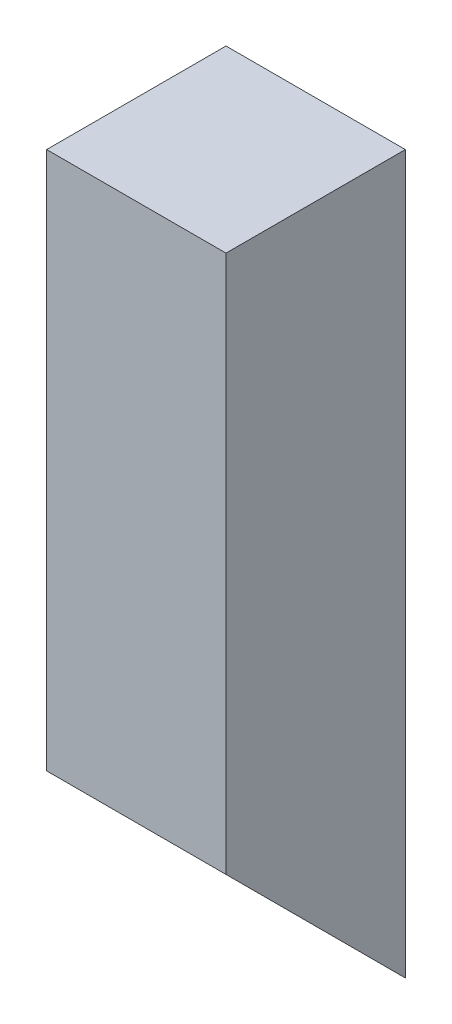
ISO-10303-21;
HEADER;
FILE_DESCRIPTION(('STEP AP214'),'2;1');
FILE_NAME('part.step','',(''),(''),'','','');
FILE_SCHEMA(('AUTOMOTIVE_DESIGN { 1 0 10303 214 1 1 1 1 }'));
ENDSEC;
DATA;
#1=APPLICATION_CONTEXT('core data for automotive mechanical design processes');
#2=APPLICATION_PROTOCOL_DEFINITION('international standard','automotive_design',2000,#1);
#3=PRODUCT_CONTEXT('',#1,'mechanical');
#4=PRODUCT('Part','Part','',(#3));
#5=PRODUCT_RELATED_PRODUCT_CATEGORY('part','',(#4));
#6=PRODUCT_DEFINITION_FORMATION('','',#4);
#7=PRODUCT_DEFINITION_CONTEXT('part definition',#1,'design');
#8=PRODUCT_DEFINITION('design','',#6,#7);
#9=PRODUCT_DEFINITION_SHAPE('','',#8);
#10=(LENGTH_UNIT() NAMED_UNIT(*) SI_UNIT(.MILLI.,.METRE.));
#11=(NAMED_UNIT(*) PLANE_ANGLE_UNIT() SI_UNIT($,.RADIAN.));
#12=(NAMED_UNIT(*) SI_UNIT($,.STERADIAN.) SOLID_ANGLE_UNIT());
#13=UNCERTAINTY_MEASURE_WITH_UNIT(LENGTH_MEASURE(1.E-05),#10,'distance_accuracy_value','');
#14=(GEOMETRIC_REPRESENTATION_CONTEXT(3) GLOBAL_UNCERTAINTY_ASSIGNED_CONTEXT((#13)) GLOBAL_UNIT_ASSIGNED_CONTEXT((#10,
#11,#12)) REPRESENTATION_CONTEXT('',''));
#15=CARTESIAN_POINT('',(0.,0.,0.));
#16=DIRECTION('',(0.,0.,1.));
#17=DIRECTION('',(1.,0.,0.));
#18=AXIS2_PLACEMENT_3D('',#15,#16,#17);
#19=CARTESIAN_POINT('',(0.,355.6,0.));
#20=DIRECTION('',(1.,0.,0.));
#21=DIRECTION('',(0.,0.,-1.));
#22=AXIS2_PLACEMENT_3D('',#19,#20,#21);
#23=PLANE('',#22);
#24=DIRECTION('',(0.,-1.,0.));
#25=VECTOR('',#24,1.);
#26=CARTESIAN_POINT('',(0.,355.6,-88.9));
#27=LINE('',#26,#25);
#28=CARTESIAN_POINT('',(0.,355.6,-88.9));
#29=VERTEX_POINT('',#28);
#30=CARTESIAN_POINT('',(0.,0.,-88.9));
#31=VERTEX_POINT('',#30);
#32=EDGE_CURVE('E91',#29,#31,#27,.T.);
#33=ORIENTED_EDGE('',*,*,#32,.T.);
#34=DIRECTION('',(0.,0.707106781186548,0.707106781186547));
#35=VECTOR('',#34,1.);
#36=CARTESIAN_POINT('',(0.,222.25,133.35));
#37=LINE('',#36,#35);
#38=CARTESIAN_POINT('',(0.,88.9000000000002,0.));
#39=VERTEX_POINT('',#38);
#40=EDGE_CURVE('E75',#31,#39,#37,.T.);
#41=ORIENTED_EDGE('',*,*,#40,.T.);
#42=DIRECTION('',(0.,-1.,0.));
#43=VECTOR('',#42,1.);
#44=CARTESIAN_POINT('',(0.,355.6,0.));
#45=LINE('',#44,#43);
#46=CARTESIAN_POINT('',(0.,355.6,0.));
#47=VERTEX_POINT('',#46);
#48=EDGE_CURVE('E11',#47,#39,#45,.T.);
#49=ORIENTED_EDGE('',*,*,#48,.F.);
#50=DIRECTION('',(0.,0.,1.));
#51=VECTOR('',#50,1.);
#52=CARTESIAN_POINT('',(0.,355.6,0.));
#53=LINE('',#52,#51);
#54=EDGE_CURVE('E79',#29,#47,#53,.T.);
#55=ORIENTED_EDGE('',*,*,#54,.F.);
#56=EDGE_LOOP('',(#33,#41,#49,#55));
#57=FACE_BOUND('',#56,.T.);
#58=ADVANCED_FACE('F33',(#57),#23,.F.);
#59=CARTESIAN_POINT('',(0.,355.6,0.));
#60=DIRECTION('',(0.,0.,-1.));
#61=DIRECTION('',(-1.,0.,0.));
#62=AXIS2_PLACEMENT_3D('',#59,#60,#61);
#63=PLANE('',#62);
#64=ORIENTED_EDGE('',*,*,#48,.T.);
#65=DIRECTION('',(1.,0.,0.));
#66=VECTOR('',#65,1.);
#67=CARTESIAN_POINT('',(-317.5,88.9000000000002,0.));
#68=LINE('',#67,#66);
#69=CARTESIAN_POINT('',(88.9,88.9000000000002,0.));
#70=VERTEX_POINT('',#69);
#71=EDGE_CURVE('E88',#39,#70,#68,.T.);
#72=ORIENTED_EDGE('',*,*,#71,.T.);
#73=DIRECTION('',(0.,-1.,0.));
#74=VECTOR('',#73,1.);
#75=CARTESIAN_POINT('',(88.9,355.6,0.));
#76=LINE('',#75,#74);
#77=CARTESIAN_POINT('',(88.9,355.6,0.));
#78=VERTEX_POINT('',#77);
#79=EDGE_CURVE('E41',#78,#70,#76,.T.);
#80=ORIENTED_EDGE('',*,*,#79,.F.);
#81=DIRECTION('',(1.,0.,0.));
#82=VECTOR('',#81,1.);
#83=CARTESIAN_POINT('',(0.,355.6,0.));
#84=LINE('',#83,#82);
#85=EDGE_CURVE('E98',#47,#78,#84,.T.);
#86=ORIENTED_EDGE('',*,*,#85,.F.);
#87=EDGE_LOOP('',(#64,#72,#80,#86));
#88=FACE_BOUND('',#87,.T.);
#89=ADVANCED_FACE('F103',(#88),#63,.F.);
#90=CARTESIAN_POINT('',(88.9,355.6,0.));
#91=DIRECTION('',(-1.,0.,0.));
#92=DIRECTION('',(0.,0.,1.));
#93=AXIS2_PLACEMENT_3D('',#90,#91,#92);
#94=PLANE('',#93);
#95=ORIENTED_EDGE('',*,*,#79,.T.);
#96=DIRECTION('',(0.,0.707106781186549,0.707106781186547));
#97=VECTOR('',#96,1.);
#98=CARTESIAN_POINT('',(88.9,44.45,-44.4500000000001));
#99=LINE('',#98,#97);
#100=CARTESIAN_POINT('',(88.9,0.,-88.9));
#101=VERTEX_POINT('',#100);
#102=EDGE_CURVE('E72',#101,#70,#99,.T.);
#103=ORIENTED_EDGE('',*,*,#102,.F.);
#104=DIRECTION('',(0.,-1.,0.));
#105=VECTOR('',#104,1.);
#106=CARTESIAN_POINT('',(88.9,355.6,-88.9));
#107=LINE('',#106,#105);
#108=CARTESIAN_POINT('',(88.9,355.6,-88.9));
#109=VERTEX_POINT('',#108);
#110=EDGE_CURVE('E86',#109,#101,#107,.T.);
#111=ORIENTED_EDGE('',*,*,#110,.F.);
#112=DIRECTION('',(0.,0.,-1.));
#113=VECTOR('',#112,1.);
#114=CARTESIAN_POINT('',(88.9,355.6,0.));
#115=LINE('',#114,#113);
#116=EDGE_CURVE('E96',#78,#109,#115,.T.);
#117=ORIENTED_EDGE('',*,*,#116,.F.);
#118=EDGE_LOOP('',(#95,#103,#111,#117));
#119=FACE_BOUND('',#118,.T.);
#120=ADVANCED_FACE('F84',(#119),#94,.F.);
#121=CARTESIAN_POINT('',(0.,355.6,-88.9));
#122=DIRECTION('',(0.,0.,1.));
#123=DIRECTION('',(1.,0.,0.));
#124=AXIS2_PLACEMENT_3D('',#121,#122,#123);
#125=PLANE('',#124);
#126=DIRECTION('',(-1.,0.,0.));
#127=VECTOR('',#126,1.);
#128=CARTESIAN_POINT('',(0.,0.,-88.9));
#129=LINE('',#128,#127);
#130=EDGE_CURVE('E69',#101,#31,#129,.T.);
#131=ORIENTED_EDGE('',*,*,#130,.T.);
#132=ORIENTED_EDGE('',*,*,#32,.F.);
#133=DIRECTION('',(-1.,0.,0.));
#134=VECTOR('',#133,1.);
#135=CARTESIAN_POINT('',(0.,355.6,-88.9));
#136=LINE('',#135,#134);
#137=EDGE_CURVE('E48',#109,#29,#136,.T.);
#138=ORIENTED_EDGE('',*,*,#137,.F.);
#139=ORIENTED_EDGE('',*,*,#110,.T.);
#140=EDGE_LOOP('',(#131,#132,#138,#139));
#141=FACE_BOUND('',#140,.T.);
#142=ADVANCED_FACE('F90',(#141),#125,.F.);
#143=CARTESIAN_POINT('',(0.,355.6,0.));
#144=DIRECTION('',(0.,-1.,0.));
#145=DIRECTION('',(0.,0.,-1.));
#146=AXIS2_PLACEMENT_3D('',#143,#144,#145);
#147=PLANE('',#146);
#148=ORIENTED_EDGE('',*,*,#54,.T.);
#149=ORIENTED_EDGE('',*,*,#85,.T.);
#150=ORIENTED_EDGE('',*,*,#116,.T.);
#151=ORIENTED_EDGE('',*,*,#137,.T.);
#152=EDGE_LOOP('',(#148,#149,#150,#151));
#153=FACE_BOUND('',#152,.T.);
#154=ADVANCED_FACE('F107',(#153),#147,.F.);
#155=CARTESIAN_POINT('',(-317.5,44.45,-44.4500000000001));
#156=DIRECTION('',(0.,0.707106781186547,-0.707106781186548));
#157=DIRECTION('',(0.,0.707106781186548,0.707106781186547));
#158=AXIS2_PLACEMENT_3D('',#155,#156,#157);
#159=PLANE('',#158);
#160=ORIENTED_EDGE('',*,*,#130,.F.);
#161=ORIENTED_EDGE('',*,*,#102,.T.);
#162=ORIENTED_EDGE('',*,*,#71,.F.);
#163=ORIENTED_EDGE('',*,*,#40,.F.);
#164=EDGE_LOOP('',(#160,#161,#162,#163));
#165=FACE_BOUND('',#164,.T.);
#166=ADVANCED_FACE('F71',(#165),#159,.F.);
#167=CLOSED_SHELL('',(#58,#89,#120,#142,#154,#166));
#168=MANIFOLD_SOLID_BREP('B2',#167);
#169=ADVANCED_BREP_SHAPE_REPRESENTATION('',(#18,#168),#14);
#170=SHAPE_DEFINITION_REPRESENTATION(#9,#169);
ENDSEC;
END-ISO-10303-21;
